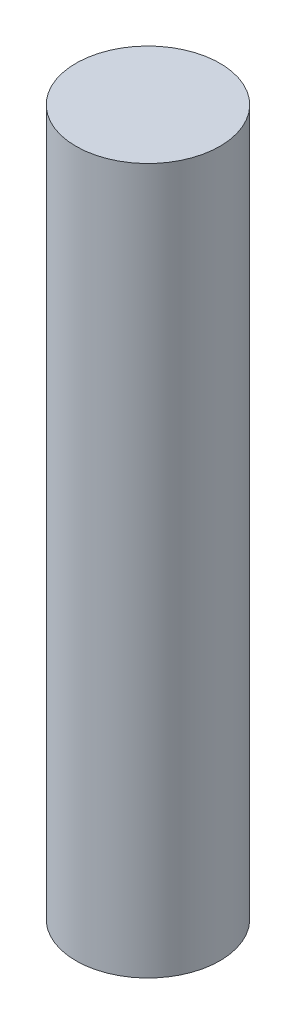
ISO-10303-21;
HEADER;
FILE_DESCRIPTION(('STEP AP214'),'2;1');
FILE_NAME('part.step','',(''),(''),'','','');
FILE_SCHEMA(('AUTOMOTIVE_DESIGN { 1 0 10303 214 1 1 1 1 }'));
ENDSEC;
DATA;
#1=APPLICATION_CONTEXT('core data for automotive mechanical design processes');
#2=APPLICATION_PROTOCOL_DEFINITION('international standard','automotive_design',2000,#1);
#3=PRODUCT_CONTEXT('',#1,'mechanical');
#4=PRODUCT('Part','Part','',(#3));
#5=PRODUCT_RELATED_PRODUCT_CATEGORY('part','',(#4));
#6=PRODUCT_DEFINITION_FORMATION('','',#4);
#7=PRODUCT_DEFINITION_CONTEXT('part definition',#1,'design');
#8=PRODUCT_DEFINITION('design','',#6,#7);
#9=PRODUCT_DEFINITION_SHAPE('','',#8);
#10=(LENGTH_UNIT() NAMED_UNIT(*) SI_UNIT(.MILLI.,.METRE.));
#11=(NAMED_UNIT(*) PLANE_ANGLE_UNIT() SI_UNIT($,.RADIAN.));
#12=(NAMED_UNIT(*) SI_UNIT($,.STERADIAN.) SOLID_ANGLE_UNIT());
#13=UNCERTAINTY_MEASURE_WITH_UNIT(LENGTH_MEASURE(1.E-05),#10,'distance_accuracy_value','');
#14=(GEOMETRIC_REPRESENTATION_CONTEXT(3) GLOBAL_UNCERTAINTY_ASSIGNED_CONTEXT((#13)) GLOBAL_UNIT_ASSIGNED_CONTEXT((#10,
#11,#12)) REPRESENTATION_CONTEXT('',''));
#15=CARTESIAN_POINT('',(0.,0.,0.));
#16=DIRECTION('',(0.,0.,1.));
#17=DIRECTION('',(1.,0.,0.));
#18=AXIS2_PLACEMENT_3D('',#15,#16,#17);
#19=CARTESIAN_POINT('',(0.,24.5,0.));
#20=DIRECTION('',(0.,-1.,0.));
#21=DIRECTION('',(0.,0.,-1.));
#22=AXIS2_PLACEMENT_3D('',#19,#20,#21);
#23=CYLINDRICAL_SURFACE('',#22,2.5);
#24=CARTESIAN_POINT('',(0.,24.5,0.));
#25=DIRECTION('',(0.,1.,0.));
#26=DIRECTION('',(0.,0.,1.));
#27=AXIS2_PLACEMENT_3D('',#24,#25,#26);
#28=CIRCLE('',#27,2.5);
#29=CARTESIAN_POINT('',(0.,24.5,2.5));
#30=VERTEX_POINT('',#29);
#31=EDGE_CURVE('E10',#30,#30,#28,.T.);
#32=ORIENTED_EDGE('',*,*,#31,.F.);
#33=EDGE_LOOP('',(#32));
#34=FACE_BOUND('',#33,.T.);
#35=CARTESIAN_POINT('',(0.,0.,0.));
#36=DIRECTION('',(0.,1.,0.));
#37=DIRECTION('',(0.,0.,1.));
#38=AXIS2_PLACEMENT_3D('',#35,#36,#37);
#39=CIRCLE('',#38,2.5);
#40=CARTESIAN_POINT('',(0.,0.,2.5));
#41=VERTEX_POINT('',#40);
#42=EDGE_CURVE('E36',#41,#41,#39,.T.);
#43=ORIENTED_EDGE('',*,*,#42,.T.);
#44=EDGE_LOOP('',(#43));
#45=FACE_BOUND('',#44,.T.);
#46=ADVANCED_FACE('F33',(#34,#45),#23,.T.);
#47=CARTESIAN_POINT('',(0.,24.5,0.));
#48=DIRECTION('',(0.,1.,0.));
#49=DIRECTION('',(0.,0.,1.));
#50=AXIS2_PLACEMENT_3D('',#47,#48,#49);
#51=PLANE('',#50);
#52=ORIENTED_EDGE('',*,*,#31,.T.);
#53=EDGE_LOOP('',(#52));
#54=FACE_BOUND('',#53,.T.);
#55=ADVANCED_FACE('F48',(#54),#51,.T.);
#56=CARTESIAN_POINT('',(0.,0.,0.));
#57=DIRECTION('',(0.,1.,0.));
#58=DIRECTION('',(0.,0.,1.));
#59=AXIS2_PLACEMENT_3D('',#56,#57,#58);
#60=PLANE('',#59);
#61=ORIENTED_EDGE('',*,*,#42,.F.);
#62=EDGE_LOOP('',(#61));
#63=FACE_BOUND('',#62,.T.);
#64=ADVANCED_FACE('F46',(#63),#60,.F.);
#65=CLOSED_SHELL('',(#46,#55,#64));
#66=MANIFOLD_SOLID_BREP('B2',#65);
#67=ADVANCED_BREP_SHAPE_REPRESENTATION('',(#18,#66),#14);
#68=SHAPE_DEFINITION_REPRESENTATION(#9,#67);
ENDSEC;
END-ISO-10303-21;
